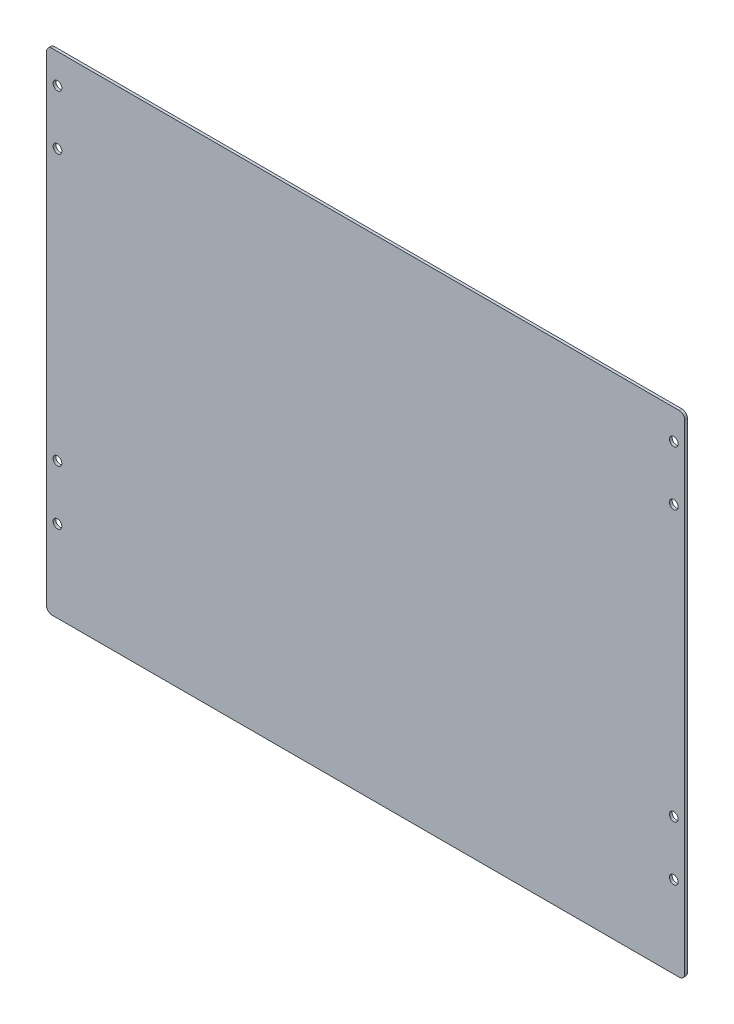
ISO-10303-21;
HEADER;
FILE_DESCRIPTION(('STEP AP214'),'2;1');
FILE_NAME('part.step','',(''),(''),'','','');
FILE_SCHEMA(('AUTOMOTIVE_DESIGN { 1 0 10303 214 1 1 1 1 }'));
ENDSEC;
DATA;
#1=APPLICATION_CONTEXT('core data for automotive mechanical design processes');
#2=APPLICATION_PROTOCOL_DEFINITION('international standard','automotive_design',2000,#1);
#3=PRODUCT_CONTEXT('',#1,'mechanical');
#4=PRODUCT('Part','Part','',(#3));
#5=PRODUCT_RELATED_PRODUCT_CATEGORY('part','',(#4));
#6=PRODUCT_DEFINITION_FORMATION('','',#4);
#7=PRODUCT_DEFINITION_CONTEXT('part definition',#1,'design');
#8=PRODUCT_DEFINITION('design','',#6,#7);
#9=PRODUCT_DEFINITION_SHAPE('','',#8);
#10=(LENGTH_UNIT() NAMED_UNIT(*) SI_UNIT(.MILLI.,.METRE.));
#11=(NAMED_UNIT(*) PLANE_ANGLE_UNIT() SI_UNIT($,.RADIAN.));
#12=(NAMED_UNIT(*) SI_UNIT($,.STERADIAN.) SOLID_ANGLE_UNIT());
#13=UNCERTAINTY_MEASURE_WITH_UNIT(LENGTH_MEASURE(1.E-05),#10,'distance_accuracy_value','');
#14=(GEOMETRIC_REPRESENTATION_CONTEXT(3) GLOBAL_UNCERTAINTY_ASSIGNED_CONTEXT((#13)) GLOBAL_UNIT_ASSIGNED_CONTEXT((#10,
#11,#12)) REPRESENTATION_CONTEXT('',''));
#15=CARTESIAN_POINT('',(0.,0.,0.));
#16=DIRECTION('',(0.,0.,1.));
#17=DIRECTION('',(1.,0.,0.));
#18=AXIS2_PLACEMENT_3D('',#15,#16,#17);
#19=CARTESIAN_POINT('',(117.,90.,1.));
#20=DIRECTION('',(-1.,0.,0.));
#21=DIRECTION('',(0.,0.,1.));
#22=AXIS2_PLACEMENT_3D('',#19,#20,#21);
#23=PLANE('',#22);
#24=DIRECTION('',(0.,1.,0.));
#25=VECTOR('',#24,1.);
#26=CARTESIAN_POINT('',(117.,90.,1.));
#27=LINE('',#26,#25);
#28=CARTESIAN_POINT('',(117.,-88.,1.));
#29=VERTEX_POINT('',#28);
#30=CARTESIAN_POINT('',(117.,88.,1.));
#31=VERTEX_POINT('',#30);
#32=EDGE_CURVE('E121',#29,#31,#27,.T.);
#33=ORIENTED_EDGE('',*,*,#32,.F.);
#34=DIRECTION('',(0.,0.,-1.));
#35=VECTOR('',#34,1.);
#36=CARTESIAN_POINT('',(117.,-88.,1.));
#37=LINE('',#36,#35);
#38=CARTESIAN_POINT('',(117.,-88.,0.));
#39=VERTEX_POINT('',#38);
#40=EDGE_CURVE('E106',#29,#39,#37,.T.);
#41=ORIENTED_EDGE('',*,*,#40,.T.);
#42=DIRECTION('',(0.,1.,0.));
#43=VECTOR('',#42,1.);
#44=CARTESIAN_POINT('',(117.,90.,0.));
#45=LINE('',#44,#43);
#46=CARTESIAN_POINT('',(117.,88.,0.));
#47=VERTEX_POINT('',#46);
#48=EDGE_CURVE('E118',#39,#47,#45,.T.);
#49=ORIENTED_EDGE('',*,*,#48,.T.);
#50=DIRECTION('',(0.,0.,-1.));
#51=VECTOR('',#50,1.);
#52=CARTESIAN_POINT('',(117.,88.,1.));
#53=LINE('',#52,#51);
#54=EDGE_CURVE('E123',#47,#31,#53,.F.);
#55=ORIENTED_EDGE('',*,*,#54,.T.);
#56=EDGE_LOOP('',(#33,#41,#49,#55));
#57=FACE_BOUND('',#56,.T.);
#58=ADVANCED_FACE('F35',(#57),#23,.F.);
#59=CARTESIAN_POINT('',(-117.,90.,1.));
#60=DIRECTION('',(0.,-1.,0.));
#61=DIRECTION('',(0.,0.,-1.));
#62=AXIS2_PLACEMENT_3D('',#59,#60,#61);
#63=PLANE('',#62);
#64=DIRECTION('',(-1.,0.,0.));
#65=VECTOR('',#64,1.);
#66=CARTESIAN_POINT('',(-117.,90.,1.));
#67=LINE('',#66,#65);
#68=CARTESIAN_POINT('',(115.,90.,1.));
#69=VERTEX_POINT('',#68);
#70=CARTESIAN_POINT('',(-115.,90.,1.));
#71=VERTEX_POINT('',#70);
#72=EDGE_CURVE('E186',#69,#71,#67,.T.);
#73=ORIENTED_EDGE('',*,*,#72,.F.);
#74=DIRECTION('',(0.,0.,-1.));
#75=VECTOR('',#74,1.);
#76=CARTESIAN_POINT('',(115.,90.,1.));
#77=LINE('',#76,#75);
#78=CARTESIAN_POINT('',(115.,90.,0.));
#79=VERTEX_POINT('',#78);
#80=EDGE_CURVE('E11',#69,#79,#77,.T.);
#81=ORIENTED_EDGE('',*,*,#80,.T.);
#82=DIRECTION('',(-1.,0.,0.));
#83=VECTOR('',#82,1.);
#84=CARTESIAN_POINT('',(-117.,90.,0.));
#85=LINE('',#84,#83);
#86=CARTESIAN_POINT('',(-115.,90.,0.));
#87=VERTEX_POINT('',#86);
#88=EDGE_CURVE('E128',#79,#87,#85,.T.);
#89=ORIENTED_EDGE('',*,*,#88,.T.);
#90=DIRECTION('',(0.,0.,-1.));
#91=VECTOR('',#90,1.);
#92=CARTESIAN_POINT('',(-115.,90.,1.));
#93=LINE('',#92,#91);
#94=EDGE_CURVE('E43',#87,#71,#93,.F.);
#95=ORIENTED_EDGE('',*,*,#94,.T.);
#96=EDGE_LOOP('',(#73,#81,#89,#95));
#97=FACE_BOUND('',#96,.T.);
#98=ADVANCED_FACE('F185',(#97),#63,.F.);
#99=CARTESIAN_POINT('',(-117.,90.,1.));
#100=DIRECTION('',(1.,0.,0.));
#101=DIRECTION('',(0.,0.,-1.));
#102=AXIS2_PLACEMENT_3D('',#99,#100,#101);
#103=PLANE('',#102);
#104=DIRECTION('',(0.,-1.,0.));
#105=VECTOR('',#104,1.);
#106=CARTESIAN_POINT('',(-117.,90.,0.));
#107=LINE('',#106,#105);
#108=CARTESIAN_POINT('',(-117.,88.,0.));
#109=VERTEX_POINT('',#108);
#110=CARTESIAN_POINT('',(-117.,-88.,0.));
#111=VERTEX_POINT('',#110);
#112=EDGE_CURVE('E132',#109,#111,#107,.T.);
#113=ORIENTED_EDGE('',*,*,#112,.T.);
#114=DIRECTION('',(0.,0.,-1.));
#115=VECTOR('',#114,1.);
#116=CARTESIAN_POINT('',(-117.,-88.,1.));
#117=LINE('',#116,#115);
#118=CARTESIAN_POINT('',(-117.,-88.,1.));
#119=VERTEX_POINT('',#118);
#120=EDGE_CURVE('E50',#111,#119,#117,.F.);
#121=ORIENTED_EDGE('',*,*,#120,.T.);
#122=DIRECTION('',(0.,-1.,0.));
#123=VECTOR('',#122,1.);
#124=CARTESIAN_POINT('',(-117.,90.,1.));
#125=LINE('',#124,#123);
#126=CARTESIAN_POINT('',(-117.,88.,1.));
#127=VERTEX_POINT('',#126);
#128=EDGE_CURVE('E192',#127,#119,#125,.T.);
#129=ORIENTED_EDGE('',*,*,#128,.F.);
#130=DIRECTION('',(0.,0.,-1.));
#131=VECTOR('',#130,1.);
#132=CARTESIAN_POINT('',(-117.,88.,1.));
#133=LINE('',#132,#131);
#134=EDGE_CURVE('E179',#127,#109,#133,.T.);
#135=ORIENTED_EDGE('',*,*,#134,.T.);
#136=EDGE_LOOP('',(#113,#121,#129,#135));
#137=FACE_BOUND('',#136,.T.);
#138=ADVANCED_FACE('F196',(#137),#103,.F.);
#139=CARTESIAN_POINT('',(-117.,-90.,1.));
#140=DIRECTION('',(0.,1.,0.));
#141=DIRECTION('',(0.,0.,1.));
#142=AXIS2_PLACEMENT_3D('',#139,#140,#141);
#143=PLANE('',#142);
#144=DIRECTION('',(1.,0.,0.));
#145=VECTOR('',#144,1.);
#146=CARTESIAN_POINT('',(-117.,-90.,0.));
#147=LINE('',#146,#145);
#148=CARTESIAN_POINT('',(-115.,-90.,0.));
#149=VERTEX_POINT('',#148);
#150=CARTESIAN_POINT('',(115.,-90.,0.));
#151=VERTEX_POINT('',#150);
#152=EDGE_CURVE('E142',#149,#151,#147,.T.);
#153=ORIENTED_EDGE('',*,*,#152,.T.);
#154=DIRECTION('',(0.,0.,-1.));
#155=VECTOR('',#154,1.);
#156=CARTESIAN_POINT('',(115.,-90.,1.));
#157=LINE('',#156,#155);
#158=CARTESIAN_POINT('',(115.,-90.,1.));
#159=VERTEX_POINT('',#158);
#160=EDGE_CURVE('E107',#151,#159,#157,.F.);
#161=ORIENTED_EDGE('',*,*,#160,.T.);
#162=DIRECTION('',(1.,0.,0.));
#163=VECTOR('',#162,1.);
#164=CARTESIAN_POINT('',(-117.,-90.,1.));
#165=LINE('',#164,#163);
#166=CARTESIAN_POINT('',(-115.,-90.,1.));
#167=VERTEX_POINT('',#166);
#168=EDGE_CURVE('E138',#167,#159,#165,.T.);
#169=ORIENTED_EDGE('',*,*,#168,.F.);
#170=DIRECTION('',(0.,0.,-1.));
#171=VECTOR('',#170,1.);
#172=CARTESIAN_POINT('',(-115.,-90.,1.));
#173=LINE('',#172,#171);
#174=EDGE_CURVE('E112',#167,#149,#173,.T.);
#175=ORIENTED_EDGE('',*,*,#174,.T.);
#176=EDGE_LOOP('',(#153,#161,#169,#175));
#177=FACE_BOUND('',#176,.T.);
#178=ADVANCED_FACE('F203',(#177),#143,.F.);
#179=CARTESIAN_POINT('',(0.,0.,1.));
#180=DIRECTION('',(0.,0.,1.));
#181=DIRECTION('',(1.,0.,0.));
#182=AXIS2_PLACEMENT_3D('',#179,#180,#181);
#183=PLANE('',#182);
#184=CARTESIAN_POINT('',(113.,-60.,1.));
#185=DIRECTION('',(0.,0.,1.));
#186=DIRECTION('',(-1.,0.,0.));
#187=AXIS2_PLACEMENT_3D('',#184,#185,#186);
#188=CIRCLE('',#187,1.60000000000001);
#189=CARTESIAN_POINT('',(111.4,-60.,1.));
#190=VERTEX_POINT('',#189);
#191=EDGE_CURVE('E215',#190,#190,#188,.T.);
#192=ORIENTED_EDGE('',*,*,#191,.F.);
#193=EDGE_LOOP('',(#192));
#194=FACE_BOUND('',#193,.T.);
#195=CARTESIAN_POINT('',(-113.,79.12,1.));
#196=DIRECTION('',(0.,0.,1.));
#197=DIRECTION('',(1.,0.,0.));
#198=AXIS2_PLACEMENT_3D('',#195,#196,#197);
#199=CIRCLE('',#198,1.60000000000001);
#200=CARTESIAN_POINT('',(-111.4,79.12,1.));
#201=VERTEX_POINT('',#200);
#202=EDGE_CURVE('E212',#201,#201,#199,.T.);
#203=ORIENTED_EDGE('',*,*,#202,.F.);
#204=EDGE_LOOP('',(#203));
#205=FACE_BOUND('',#204,.T.);
#206=CARTESIAN_POINT('',(-113.,59.12,1.));
#207=DIRECTION('',(0.,0.,1.));
#208=DIRECTION('',(1.,0.,0.));
#209=AXIS2_PLACEMENT_3D('',#206,#207,#208);
#210=CIRCLE('',#209,1.60000000000001);
#211=CARTESIAN_POINT('',(-111.4,59.12,1.));
#212=VERTEX_POINT('',#211);
#213=EDGE_CURVE('E209',#212,#212,#210,.T.);
#214=ORIENTED_EDGE('',*,*,#213,.F.);
#215=EDGE_LOOP('',(#214));
#216=FACE_BOUND('',#215,.T.);
#217=CARTESIAN_POINT('',(-113.,-40.,1.));
#218=DIRECTION('',(0.,0.,1.));
#219=DIRECTION('',(1.,0.,0.));
#220=AXIS2_PLACEMENT_3D('',#217,#218,#219);
#221=CIRCLE('',#220,1.60000000000001);
#222=CARTESIAN_POINT('',(-111.4,-40.,1.));
#223=VERTEX_POINT('',#222);
#224=EDGE_CURVE('E208',#223,#223,#221,.T.);
#225=ORIENTED_EDGE('',*,*,#224,.F.);
#226=EDGE_LOOP('',(#225));
#227=FACE_BOUND('',#226,.T.);
#228=CARTESIAN_POINT('',(113.,-40.,1.));
#229=DIRECTION('',(0.,0.,1.));
#230=DIRECTION('',(-1.,0.,0.));
#231=AXIS2_PLACEMENT_3D('',#228,#229,#230);
#232=CIRCLE('',#231,1.60000000000001);
#233=CARTESIAN_POINT('',(111.4,-40.,1.));
#234=VERTEX_POINT('',#233);
#235=EDGE_CURVE('E218',#234,#234,#232,.T.);
#236=ORIENTED_EDGE('',*,*,#235,.F.);
#237=EDGE_LOOP('',(#236));
#238=FACE_BOUND('',#237,.T.);
#239=CARTESIAN_POINT('',(113.,59.12,1.));
#240=DIRECTION('',(0.,0.,1.));
#241=DIRECTION('',(-1.,0.,0.));
#242=AXIS2_PLACEMENT_3D('',#239,#240,#241);
#243=CIRCLE('',#242,1.60000000000001);
#244=CARTESIAN_POINT('',(111.4,59.12,1.));
#245=VERTEX_POINT('',#244);
#246=EDGE_CURVE('E224',#245,#245,#243,.T.);
#247=ORIENTED_EDGE('',*,*,#246,.F.);
#248=EDGE_LOOP('',(#247));
#249=FACE_BOUND('',#248,.T.);
#250=CARTESIAN_POINT('',(113.,79.12,1.));
#251=DIRECTION('',(0.,0.,1.));
#252=DIRECTION('',(-1.,0.,0.));
#253=AXIS2_PLACEMENT_3D('',#250,#251,#252);
#254=CIRCLE('',#253,1.60000000000001);
#255=CARTESIAN_POINT('',(111.4,79.12,1.));
#256=VERTEX_POINT('',#255);
#257=EDGE_CURVE('E221',#256,#256,#254,.T.);
#258=ORIENTED_EDGE('',*,*,#257,.F.);
#259=EDGE_LOOP('',(#258));
#260=FACE_BOUND('',#259,.T.);
#261=CARTESIAN_POINT('',(-113.,-60.,1.));
#262=DIRECTION('',(0.,0.,1.));
#263=DIRECTION('',(1.,0.,0.));
#264=AXIS2_PLACEMENT_3D('',#261,#262,#263);
#265=CIRCLE('',#264,1.60000000000001);
#266=CARTESIAN_POINT('',(-111.4,-60.,1.));
#267=VERTEX_POINT('',#266);
#268=EDGE_CURVE('E148',#267,#267,#265,.T.);
#269=ORIENTED_EDGE('',*,*,#268,.F.);
#270=EDGE_LOOP('',(#269));
#271=FACE_BOUND('',#270,.T.);
#272=ORIENTED_EDGE('',*,*,#168,.T.);
#273=CARTESIAN_POINT('',(115.,-88.,1.));
#274=DIRECTION('',(0.,0.,1.));
#275=DIRECTION('',(1.,0.,0.));
#276=AXIS2_PLACEMENT_3D('',#273,#274,#275);
#277=CIRCLE('',#276,2.);
#278=EDGE_CURVE('E177',#159,#29,#277,.T.);
#279=ORIENTED_EDGE('',*,*,#278,.T.);
#280=ORIENTED_EDGE('',*,*,#32,.T.);
#281=CARTESIAN_POINT('',(115.,88.,1.));
#282=DIRECTION('',(0.,0.,1.));
#283=DIRECTION('',(1.,0.,0.));
#284=AXIS2_PLACEMENT_3D('',#281,#282,#283);
#285=CIRCLE('',#284,2.);
#286=EDGE_CURVE('E173',#31,#69,#285,.T.);
#287=ORIENTED_EDGE('',*,*,#286,.T.);
#288=ORIENTED_EDGE('',*,*,#72,.T.);
#289=CARTESIAN_POINT('',(-115.,88.,1.));
#290=DIRECTION('',(0.,0.,1.));
#291=DIRECTION('',(1.,0.,0.));
#292=AXIS2_PLACEMENT_3D('',#289,#290,#291);
#293=CIRCLE('',#292,2.);
#294=EDGE_CURVE('E57',#71,#127,#293,.T.);
#295=ORIENTED_EDGE('',*,*,#294,.T.);
#296=ORIENTED_EDGE('',*,*,#128,.T.);
#297=CARTESIAN_POINT('',(-115.,-88.,1.));
#298=DIRECTION('',(0.,0.,1.));
#299=DIRECTION('',(1.,0.,0.));
#300=AXIS2_PLACEMENT_3D('',#297,#298,#299);
#301=CIRCLE('',#300,2.);
#302=EDGE_CURVE('E175',#119,#167,#301,.T.);
#303=ORIENTED_EDGE('',*,*,#302,.T.);
#304=EDGE_LOOP('',(#272,#279,#280,#287,#288,#295,#296,#303));
#305=FACE_BOUND('',#304,.T.);
#306=ADVANCED_FACE('F190',(#194,#205,#216,#227,#238,#249,#260,#271,#305),#183,.T.);
#307=CARTESIAN_POINT('',(0.,0.,0.));
#308=DIRECTION('',(0.,0.,1.));
#309=DIRECTION('',(1.,0.,0.));
#310=AXIS2_PLACEMENT_3D('',#307,#308,#309);
#311=PLANE('',#310);
#312=CARTESIAN_POINT('',(113.,-60.,0.));
#313=DIRECTION('',(0.,0.,1.));
#314=DIRECTION('',(1.,0.,0.));
#315=AXIS2_PLACEMENT_3D('',#312,#313,#314);
#316=CIRCLE('',#315,1.60000000000001);
#317=CARTESIAN_POINT('',(114.6,-60.,0.));
#318=VERTEX_POINT('',#317);
#319=EDGE_CURVE('E129',#318,#318,#316,.T.);
#320=ORIENTED_EDGE('',*,*,#319,.T.);
#321=EDGE_LOOP('',(#320));
#322=FACE_BOUND('',#321,.T.);
#323=CARTESIAN_POINT('',(-113.,79.12,0.));
#324=DIRECTION('',(0.,0.,1.));
#325=DIRECTION('',(1.,0.,0.));
#326=AXIS2_PLACEMENT_3D('',#323,#324,#325);
#327=CIRCLE('',#326,1.60000000000001);
#328=CARTESIAN_POINT('',(-111.4,79.12,0.));
#329=VERTEX_POINT('',#328);
#330=EDGE_CURVE('E135',#329,#329,#327,.T.);
#331=ORIENTED_EDGE('',*,*,#330,.T.);
#332=EDGE_LOOP('',(#331));
#333=FACE_BOUND('',#332,.T.);
#334=CARTESIAN_POINT('',(-113.,59.12,0.));
#335=DIRECTION('',(0.,0.,1.));
#336=DIRECTION('',(1.,0.,0.));
#337=AXIS2_PLACEMENT_3D('',#334,#335,#336);
#338=CIRCLE('',#337,1.60000000000001);
#339=CARTESIAN_POINT('',(-111.4,59.12,0.));
#340=VERTEX_POINT('',#339);
#341=EDGE_CURVE('E160',#340,#340,#338,.T.);
#342=ORIENTED_EDGE('',*,*,#341,.T.);
#343=EDGE_LOOP('',(#342));
#344=FACE_BOUND('',#343,.T.);
#345=CARTESIAN_POINT('',(-113.,-40.,0.));
#346=DIRECTION('',(0.,0.,1.));
#347=DIRECTION('',(1.,0.,0.));
#348=AXIS2_PLACEMENT_3D('',#345,#346,#347);
#349=CIRCLE('',#348,1.60000000000001);
#350=CARTESIAN_POINT('',(-111.4,-40.,0.));
#351=VERTEX_POINT('',#350);
#352=EDGE_CURVE('E157',#351,#351,#349,.T.);
#353=ORIENTED_EDGE('',*,*,#352,.T.);
#354=EDGE_LOOP('',(#353));
#355=FACE_BOUND('',#354,.T.);
#356=CARTESIAN_POINT('',(113.,-40.,0.));
#357=DIRECTION('',(0.,0.,1.));
#358=DIRECTION('',(1.,0.,0.));
#359=AXIS2_PLACEMENT_3D('',#356,#357,#358);
#360=CIRCLE('',#359,1.60000000000001);
#361=CARTESIAN_POINT('',(114.6,-40.,0.));
#362=VERTEX_POINT('',#361);
#363=EDGE_CURVE('E154',#362,#362,#360,.T.);
#364=ORIENTED_EDGE('',*,*,#363,.T.);
#365=EDGE_LOOP('',(#364));
#366=FACE_BOUND('',#365,.T.);
#367=CARTESIAN_POINT('',(113.,59.12,0.));
#368=DIRECTION('',(0.,0.,1.));
#369=DIRECTION('',(1.,0.,0.));
#370=AXIS2_PLACEMENT_3D('',#367,#368,#369);
#371=CIRCLE('',#370,1.60000000000001);
#372=CARTESIAN_POINT('',(114.6,59.12,0.));
#373=VERTEX_POINT('',#372);
#374=EDGE_CURVE('E151',#373,#373,#371,.T.);
#375=ORIENTED_EDGE('',*,*,#374,.T.);
#376=EDGE_LOOP('',(#375));
#377=FACE_BOUND('',#376,.T.);
#378=CARTESIAN_POINT('',(113.,79.12,0.));
#379=DIRECTION('',(0.,0.,1.));
#380=DIRECTION('',(1.,0.,0.));
#381=AXIS2_PLACEMENT_3D('',#378,#379,#380);
#382=CIRCLE('',#381,1.60000000000001);
#383=CARTESIAN_POINT('',(114.6,79.12,0.));
#384=VERTEX_POINT('',#383);
#385=EDGE_CURVE('E147',#384,#384,#382,.T.);
#386=ORIENTED_EDGE('',*,*,#385,.T.);
#387=EDGE_LOOP('',(#386));
#388=FACE_BOUND('',#387,.T.);
#389=CARTESIAN_POINT('',(-113.,-60.,0.));
#390=DIRECTION('',(0.,0.,1.));
#391=DIRECTION('',(1.,0.,0.));
#392=AXIS2_PLACEMENT_3D('',#389,#390,#391);
#393=CIRCLE('',#392,1.60000000000001);
#394=CARTESIAN_POINT('',(-111.4,-60.,0.));
#395=VERTEX_POINT('',#394);
#396=EDGE_CURVE('E144',#395,#395,#393,.T.);
#397=ORIENTED_EDGE('',*,*,#396,.T.);
#398=EDGE_LOOP('',(#397));
#399=FACE_BOUND('',#398,.T.);
#400=ORIENTED_EDGE('',*,*,#48,.F.);
#401=CARTESIAN_POINT('',(115.,-88.,0.));
#402=DIRECTION('',(0.,0.,1.));
#403=DIRECTION('',(1.,0.,0.));
#404=AXIS2_PLACEMENT_3D('',#401,#402,#403);
#405=CIRCLE('',#404,2.);
#406=EDGE_CURVE('E102',#39,#151,#405,.F.);
#407=ORIENTED_EDGE('',*,*,#406,.T.);
#408=ORIENTED_EDGE('',*,*,#152,.F.);
#409=CARTESIAN_POINT('',(-115.,-88.,0.));
#410=DIRECTION('',(0.,0.,1.));
#411=DIRECTION('',(1.,0.,0.));
#412=AXIS2_PLACEMENT_3D('',#409,#410,#411);
#413=CIRCLE('',#412,2.);
#414=EDGE_CURVE('E113',#149,#111,#413,.F.);
#415=ORIENTED_EDGE('',*,*,#414,.T.);
#416=ORIENTED_EDGE('',*,*,#112,.F.);
#417=CARTESIAN_POINT('',(-115.,88.,0.));
#418=DIRECTION('',(0.,0.,1.));
#419=DIRECTION('',(1.,0.,0.));
#420=AXIS2_PLACEMENT_3D('',#417,#418,#419);
#421=CIRCLE('',#420,2.);
#422=EDGE_CURVE('E122',#109,#87,#421,.F.);
#423=ORIENTED_EDGE('',*,*,#422,.T.);
#424=ORIENTED_EDGE('',*,*,#88,.F.);
#425=CARTESIAN_POINT('',(115.,88.,0.));
#426=DIRECTION('',(0.,0.,1.));
#427=DIRECTION('',(1.,0.,0.));
#428=AXIS2_PLACEMENT_3D('',#425,#426,#427);
#429=CIRCLE('',#428,2.);
#430=EDGE_CURVE('E127',#79,#47,#429,.F.);
#431=ORIENTED_EDGE('',*,*,#430,.T.);
#432=EDGE_LOOP('',(#400,#407,#408,#415,#416,#423,#424,#431));
#433=FACE_BOUND('',#432,.T.);
#434=ADVANCED_FACE('F125',(#322,#333,#344,#355,#366,#377,#388,#399,#433),#311,.F.);
#435=CARTESIAN_POINT('',(-113.,-60.,-9.));
#436=DIRECTION('',(0.,0.,1.));
#437=DIRECTION('',(1.,0.,0.));
#438=AXIS2_PLACEMENT_3D('',#435,#436,#437);
#439=CYLINDRICAL_SURFACE('',#438,1.60000000000001);
#440=ORIENTED_EDGE('',*,*,#268,.T.);
#441=EDGE_LOOP('',(#440));
#442=FACE_BOUND('',#441,.T.);
#443=ORIENTED_EDGE('',*,*,#396,.F.);
#444=EDGE_LOOP('',(#443));
#445=FACE_BOUND('',#444,.T.);
#446=ADVANCED_FACE('F243',(#442,#445),#439,.F.);
#447=CARTESIAN_POINT('',(113.,79.12,-9.));
#448=DIRECTION('',(0.,0.,1.));
#449=DIRECTION('',(1.,0.,0.));
#450=AXIS2_PLACEMENT_3D('',#447,#448,#449);
#451=CYLINDRICAL_SURFACE('',#450,1.60000000000001);
#452=ORIENTED_EDGE('',*,*,#257,.T.);
#453=EDGE_LOOP('',(#452));
#454=FACE_BOUND('',#453,.T.);
#455=ORIENTED_EDGE('',*,*,#385,.F.);
#456=EDGE_LOOP('',(#455));
#457=FACE_BOUND('',#456,.T.);
#458=ADVANCED_FACE('F246',(#454,#457),#451,.F.);
#459=CARTESIAN_POINT('',(113.,59.12,-9.));
#460=DIRECTION('',(0.,0.,1.));
#461=DIRECTION('',(1.,0.,0.));
#462=AXIS2_PLACEMENT_3D('',#459,#460,#461);
#463=CYLINDRICAL_SURFACE('',#462,1.60000000000001);
#464=ORIENTED_EDGE('',*,*,#246,.T.);
#465=EDGE_LOOP('',(#464));
#466=FACE_BOUND('',#465,.T.);
#467=ORIENTED_EDGE('',*,*,#374,.F.);
#468=EDGE_LOOP('',(#467));
#469=FACE_BOUND('',#468,.T.);
#470=ADVANCED_FACE('F376',(#466,#469),#463,.F.);
#471=CARTESIAN_POINT('',(113.,-40.,-9.));
#472=DIRECTION('',(0.,0.,1.));
#473=DIRECTION('',(1.,0.,0.));
#474=AXIS2_PLACEMENT_3D('',#471,#472,#473);
#475=CYLINDRICAL_SURFACE('',#474,1.60000000000001);
#476=ORIENTED_EDGE('',*,*,#235,.T.);
#477=EDGE_LOOP('',(#476));
#478=FACE_BOUND('',#477,.T.);
#479=ORIENTED_EDGE('',*,*,#363,.F.);
#480=EDGE_LOOP('',(#479));
#481=FACE_BOUND('',#480,.T.);
#482=ADVANCED_FACE('F230',(#478,#481),#475,.F.);
#483=CARTESIAN_POINT('',(-113.,-40.,-9.));
#484=DIRECTION('',(0.,0.,1.));
#485=DIRECTION('',(1.,0.,0.));
#486=AXIS2_PLACEMENT_3D('',#483,#484,#485);
#487=CYLINDRICAL_SURFACE('',#486,1.60000000000001);
#488=ORIENTED_EDGE('',*,*,#224,.T.);
#489=EDGE_LOOP('',(#488));
#490=FACE_BOUND('',#489,.T.);
#491=ORIENTED_EDGE('',*,*,#352,.F.);
#492=EDGE_LOOP('',(#491));
#493=FACE_BOUND('',#492,.T.);
#494=ADVANCED_FACE('F357',(#490,#493),#487,.F.);
#495=CARTESIAN_POINT('',(-113.,59.12,-9.));
#496=DIRECTION('',(0.,0.,1.));
#497=DIRECTION('',(1.,0.,0.));
#498=AXIS2_PLACEMENT_3D('',#495,#496,#497);
#499=CYLINDRICAL_SURFACE('',#498,1.60000000000001);
#500=ORIENTED_EDGE('',*,*,#213,.T.);
#501=EDGE_LOOP('',(#500));
#502=FACE_BOUND('',#501,.T.);
#503=ORIENTED_EDGE('',*,*,#341,.F.);
#504=EDGE_LOOP('',(#503));
#505=FACE_BOUND('',#504,.T.);
#506=ADVANCED_FACE('F347',(#502,#505),#499,.F.);
#507=CARTESIAN_POINT('',(-113.,79.12,-9.));
#508=DIRECTION('',(0.,0.,1.));
#509=DIRECTION('',(1.,0.,0.));
#510=AXIS2_PLACEMENT_3D('',#507,#508,#509);
#511=CYLINDRICAL_SURFACE('',#510,1.60000000000001);
#512=ORIENTED_EDGE('',*,*,#202,.T.);
#513=EDGE_LOOP('',(#512));
#514=FACE_BOUND('',#513,.T.);
#515=ORIENTED_EDGE('',*,*,#330,.F.);
#516=EDGE_LOOP('',(#515));
#517=FACE_BOUND('',#516,.T.);
#518=ADVANCED_FACE('F337',(#514,#517),#511,.F.);
#519=CARTESIAN_POINT('',(113.,-60.,-9.));
#520=DIRECTION('',(0.,0.,1.));
#521=DIRECTION('',(1.,0.,0.));
#522=AXIS2_PLACEMENT_3D('',#519,#520,#521);
#523=CYLINDRICAL_SURFACE('',#522,1.60000000000001);
#524=ORIENTED_EDGE('',*,*,#191,.T.);
#525=EDGE_LOOP('',(#524));
#526=FACE_BOUND('',#525,.T.);
#527=ORIENTED_EDGE('',*,*,#319,.F.);
#528=EDGE_LOOP('',(#527));
#529=FACE_BOUND('',#528,.T.);
#530=ADVANCED_FACE('F267',(#526,#529),#523,.F.);
#531=CARTESIAN_POINT('',(115.,-88.,1.));
#532=DIRECTION('',(0.,0.,-1.));
#533=DIRECTION('',(-1.,0.,0.));
#534=AXIS2_PLACEMENT_3D('',#531,#532,#533);
#535=CYLINDRICAL_SURFACE('',#534,2.);
#536=ORIENTED_EDGE('',*,*,#278,.F.);
#537=ORIENTED_EDGE('',*,*,#160,.F.);
#538=ORIENTED_EDGE('',*,*,#406,.F.);
#539=ORIENTED_EDGE('',*,*,#40,.F.);
#540=EDGE_LOOP('',(#536,#537,#538,#539));
#541=FACE_BOUND('',#540,.T.);
#542=ADVANCED_FACE('F105',(#541),#535,.T.);
#543=CARTESIAN_POINT('',(-115.,-88.,1.));
#544=DIRECTION('',(0.,0.,-1.));
#545=DIRECTION('',(-1.,0.,0.));
#546=AXIS2_PLACEMENT_3D('',#543,#544,#545);
#547=CYLINDRICAL_SURFACE('',#546,2.);
#548=ORIENTED_EDGE('',*,*,#302,.F.);
#549=ORIENTED_EDGE('',*,*,#120,.F.);
#550=ORIENTED_EDGE('',*,*,#414,.F.);
#551=ORIENTED_EDGE('',*,*,#174,.F.);
#552=EDGE_LOOP('',(#548,#549,#550,#551));
#553=FACE_BOUND('',#552,.T.);
#554=ADVANCED_FACE('F200',(#553),#547,.T.);
#555=CARTESIAN_POINT('',(115.,88.,1.));
#556=DIRECTION('',(0.,0.,-1.));
#557=DIRECTION('',(-1.,0.,0.));
#558=AXIS2_PLACEMENT_3D('',#555,#556,#557);
#559=CYLINDRICAL_SURFACE('',#558,2.);
#560=ORIENTED_EDGE('',*,*,#286,.F.);
#561=ORIENTED_EDGE('',*,*,#54,.F.);
#562=ORIENTED_EDGE('',*,*,#430,.F.);
#563=ORIENTED_EDGE('',*,*,#80,.F.);
#564=EDGE_LOOP('',(#560,#561,#562,#563));
#565=FACE_BOUND('',#564,.T.);
#566=ADVANCED_FACE('F269',(#565),#559,.T.);
#567=CARTESIAN_POINT('',(-115.,88.,1.));
#568=DIRECTION('',(0.,0.,-1.));
#569=DIRECTION('',(-1.,0.,0.));
#570=AXIS2_PLACEMENT_3D('',#567,#568,#569);
#571=CYLINDRICAL_SURFACE('',#570,2.);
#572=ORIENTED_EDGE('',*,*,#294,.F.);
#573=ORIENTED_EDGE('',*,*,#94,.F.);
#574=ORIENTED_EDGE('',*,*,#422,.F.);
#575=ORIENTED_EDGE('',*,*,#134,.F.);
#576=EDGE_LOOP('',(#572,#573,#574,#575));
#577=FACE_BOUND('',#576,.T.);
#578=ADVANCED_FACE('F37',(#577),#571,.T.);
#579=CLOSED_SHELL('',(#58,#98,#138,#178,#306,#434,#446,#458,#470,#482,#494,#506,#518,#530,#542,
#554,#566,#578));
#580=MANIFOLD_SOLID_BREP('B2',#579);
#581=ADVANCED_BREP_SHAPE_REPRESENTATION('',(#18,#580),#14);
#582=SHAPE_DEFINITION_REPRESENTATION(#9,#581);
ENDSEC;
END-ISO-10303-21;
